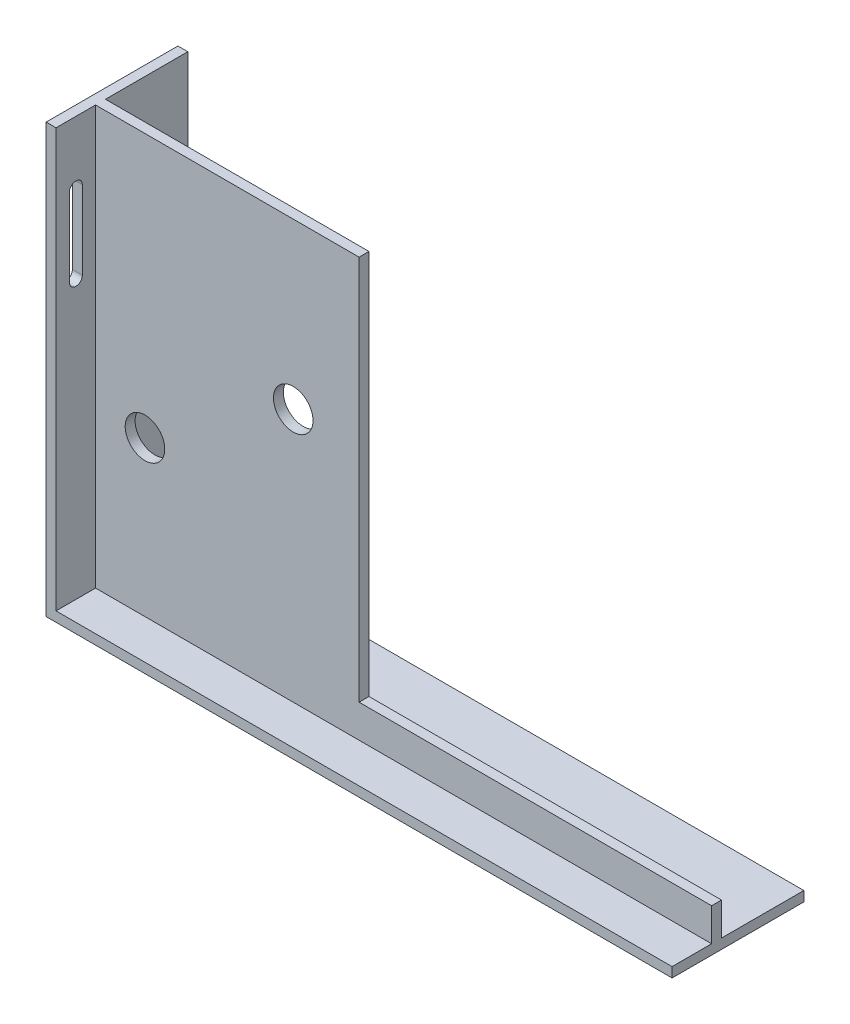
ISO-10303-21;
HEADER;
FILE_DESCRIPTION(('STEP AP214'),'2;1');
FILE_NAME('part.step','',(''),(''),'','','');
FILE_SCHEMA(('AUTOMOTIVE_DESIGN { 1 0 10303 214 1 1 1 1 }'));
ENDSEC;
DATA;
#1=APPLICATION_CONTEXT('core data for automotive mechanical design processes');
#2=APPLICATION_PROTOCOL_DEFINITION('international standard','automotive_design',2000,#1);
#3=PRODUCT_CONTEXT('',#1,'mechanical');
#4=PRODUCT('Part','Part','',(#3));
#5=PRODUCT_RELATED_PRODUCT_CATEGORY('part','',(#4));
#6=PRODUCT_DEFINITION_FORMATION('','',#4);
#7=PRODUCT_DEFINITION_CONTEXT('part definition',#1,'design');
#8=PRODUCT_DEFINITION('design','',#6,#7);
#9=PRODUCT_DEFINITION_SHAPE('','',#8);
#10=(LENGTH_UNIT() NAMED_UNIT(*) SI_UNIT(.MILLI.,.METRE.));
#11=(NAMED_UNIT(*) PLANE_ANGLE_UNIT() SI_UNIT($,.RADIAN.));
#12=(NAMED_UNIT(*) SI_UNIT($,.STERADIAN.) SOLID_ANGLE_UNIT());
#13=UNCERTAINTY_MEASURE_WITH_UNIT(LENGTH_MEASURE(1.E-05),#10,'distance_accuracy_value','');
#14=(GEOMETRIC_REPRESENTATION_CONTEXT(3) GLOBAL_UNCERTAINTY_ASSIGNED_CONTEXT((#13)) GLOBAL_UNIT_ASSIGNED_CONTEXT((#10,
#11,#12)) REPRESENTATION_CONTEXT('',''));
#15=CARTESIAN_POINT('',(0.,0.,0.));
#16=DIRECTION('',(0.,0.,1.));
#17=DIRECTION('',(1.,0.,0.));
#18=AXIS2_PLACEMENT_3D('',#15,#16,#17);
#19=CARTESIAN_POINT('',(-3.,3.,-25.));
#20=DIRECTION('',(0.,-1.,0.));
#21=DIRECTION('',(0.,0.,-1.));
#22=AXIS2_PLACEMENT_3D('',#19,#20,#21);
#23=PLANE('',#22);
#24=DIRECTION('',(0.,0.,1.));
#25=VECTOR('',#24,1.);
#26=CARTESIAN_POINT('',(187.,3.,15.));
#27=LINE('',#26,#25);
#28=CARTESIAN_POINT('',(187.,3.,3.));
#29=VERTEX_POINT('',#28);
#30=CARTESIAN_POINT('',(187.,3.,15.));
#31=VERTEX_POINT('',#30);
#32=EDGE_CURVE('E198',#29,#31,#27,.T.);
#33=ORIENTED_EDGE('',*,*,#32,.F.);
#34=DIRECTION('',(-1.,0.,0.));
#35=VECTOR('',#34,1.);
#36=CARTESIAN_POINT('',(0.,3.,3.));
#37=LINE('',#36,#35);
#38=CARTESIAN_POINT('',(0.,3.,3.));
#39=VERTEX_POINT('',#38);
#40=EDGE_CURVE('E211',#29,#39,#37,.T.);
#41=ORIENTED_EDGE('',*,*,#40,.T.);
#42=DIRECTION('',(0.,0.,1.));
#43=VECTOR('',#42,1.);
#44=CARTESIAN_POINT('',(0.,3.,-25.));
#45=LINE('',#44,#43);
#46=CARTESIAN_POINT('',(0.,3.,15.));
#47=VERTEX_POINT('',#46);
#48=EDGE_CURVE('E11',#39,#47,#45,.T.);
#49=ORIENTED_EDGE('',*,*,#48,.T.);
#50=DIRECTION('',(-1.,0.,0.));
#51=VECTOR('',#50,1.);
#52=CARTESIAN_POINT('',(-3.,3.,15.));
#53=LINE('',#52,#51);
#54=EDGE_CURVE('E202',#31,#47,#53,.T.);
#55=ORIENTED_EDGE('',*,*,#54,.F.);
#56=EDGE_LOOP('',(#33,#41,#49,#55));
#57=FACE_BOUND('',#56,.T.);
#58=ADVANCED_FACE('F32',(#57),#23,.F.);
#59=CARTESIAN_POINT('',(80.,0.,3.));
#60=DIRECTION('',(-1.,0.,0.));
#61=DIRECTION('',(0.,0.,1.));
#62=AXIS2_PLACEMENT_3D('',#59,#60,#61);
#63=PLANE('',#62);
#64=DIRECTION('',(0.,1.,0.));
#65=VECTOR('',#64,1.);
#66=CARTESIAN_POINT('',(80.,0.,3.));
#67=LINE('',#66,#65);
#68=CARTESIAN_POINT('',(80.,13.,3.));
#69=VERTEX_POINT('',#68);
#70=CARTESIAN_POINT('',(80.,130.,3.));
#71=VERTEX_POINT('',#70);
#72=EDGE_CURVE('E356',#69,#71,#67,.T.);
#73=ORIENTED_EDGE('',*,*,#72,.F.);
#74=DIRECTION('',(0.,0.,-1.));
#75=VECTOR('',#74,1.);
#76=CARTESIAN_POINT('',(80.,13.,110.466273779265));
#77=LINE('',#76,#75);
#78=CARTESIAN_POINT('',(80.,13.,0.));
#79=VERTEX_POINT('',#78);
#80=EDGE_CURVE('E190',#69,#79,#77,.T.);
#81=ORIENTED_EDGE('',*,*,#80,.T.);
#82=DIRECTION('',(0.,1.,0.));
#83=VECTOR('',#82,1.);
#84=CARTESIAN_POINT('',(80.,0.,0.));
#85=LINE('',#84,#83);
#86=CARTESIAN_POINT('',(80.,130.,0.));
#87=VERTEX_POINT('',#86);
#88=EDGE_CURVE('E370',#79,#87,#85,.T.);
#89=ORIENTED_EDGE('',*,*,#88,.T.);
#90=DIRECTION('',(0.,0.,-1.));
#91=VECTOR('',#90,1.);
#92=CARTESIAN_POINT('',(80.,130.,3.));
#93=LINE('',#92,#91);
#94=EDGE_CURVE('E40',#71,#87,#93,.T.);
#95=ORIENTED_EDGE('',*,*,#94,.F.);
#96=EDGE_LOOP('',(#73,#81,#89,#95));
#97=FACE_BOUND('',#96,.T.);
#98=ADVANCED_FACE('F302',(#97),#63,.F.);
#99=CARTESIAN_POINT('',(0.,130.,3.));
#100=DIRECTION('',(0.,0.,-1.));
#101=DIRECTION('',(-1.,0.,0.));
#102=AXIS2_PLACEMENT_3D('',#99,#100,#101);
#103=PLANE('',#102);
#104=CARTESIAN_POINT('',(60.,80.,3.));
#105=DIRECTION('',(0.,0.,1.));
#106=DIRECTION('',(1.,0.,0.));
#107=AXIS2_PLACEMENT_3D('',#104,#105,#106);
#108=CIRCLE('',#107,6.);
#109=CARTESIAN_POINT('',(66.,80.,3.));
#110=VERTEX_POINT('',#109);
#111=EDGE_CURVE('E347',#110,#110,#108,.T.);
#112=ORIENTED_EDGE('',*,*,#111,.F.);
#113=EDGE_LOOP('',(#112));
#114=FACE_BOUND('',#113,.T.);
#115=CARTESIAN_POINT('',(15.,50.,3.));
#116=DIRECTION('',(0.,0.,1.));
#117=DIRECTION('',(1.,0.,0.));
#118=AXIS2_PLACEMENT_3D('',#115,#116,#117);
#119=CIRCLE('',#118,6.);
#120=CARTESIAN_POINT('',(21.,50.,3.));
#121=VERTEX_POINT('',#120);
#122=EDGE_CURVE('E247',#121,#121,#119,.T.);
#123=ORIENTED_EDGE('',*,*,#122,.F.);
#124=EDGE_LOOP('',(#123));
#125=FACE_BOUND('',#124,.T.);
#126=ORIENTED_EDGE('',*,*,#40,.F.);
#127=DIRECTION('',(0.,1.,0.));
#128=VECTOR('',#127,1.);
#129=CARTESIAN_POINT('',(187.,3.,3.));
#130=LINE('',#129,#128);
#131=CARTESIAN_POINT('',(187.,13.,3.));
#132=VERTEX_POINT('',#131);
#133=EDGE_CURVE('E181',#29,#132,#130,.T.);
#134=ORIENTED_EDGE('',*,*,#133,.T.);
#135=DIRECTION('',(-1.,0.,0.));
#136=VECTOR('',#135,1.);
#137=CARTESIAN_POINT('',(80.,13.,3.));
#138=LINE('',#137,#136);
#139=EDGE_CURVE('E183',#132,#69,#138,.T.);
#140=ORIENTED_EDGE('',*,*,#139,.T.);
#141=ORIENTED_EDGE('',*,*,#72,.T.);
#142=DIRECTION('',(-1.,0.,0.));
#143=VECTOR('',#142,1.);
#144=CARTESIAN_POINT('',(0.,130.,3.));
#145=LINE('',#144,#143);
#146=CARTESIAN_POINT('',(0.,130.,3.));
#147=VERTEX_POINT('',#146);
#148=EDGE_CURVE('E364',#71,#147,#145,.T.);
#149=ORIENTED_EDGE('',*,*,#148,.T.);
#150=DIRECTION('',(0.,-1.,0.));
#151=VECTOR('',#150,1.);
#152=CARTESIAN_POINT('',(0.,0.,3.));
#153=LINE('',#152,#151);
#154=EDGE_CURVE('E359',#147,#39,#153,.T.);
#155=ORIENTED_EDGE('',*,*,#154,.T.);
#156=EDGE_LOOP('',(#126,#134,#140,#141,#149,#155));
#157=FACE_BOUND('',#156,.T.);
#158=ADVANCED_FACE('F308',(#114,#125,#157),#103,.F.);
#159=CARTESIAN_POINT('',(0.,130.,0.));
#160=DIRECTION('',(0.,0.,-1.));
#161=DIRECTION('',(-1.,0.,0.));
#162=AXIS2_PLACEMENT_3D('',#159,#160,#161);
#163=PLANE('',#162);
#164=CARTESIAN_POINT('',(60.,80.,0.));
#165=DIRECTION('',(0.,0.,1.));
#166=DIRECTION('',(1.,0.,0.));
#167=AXIS2_PLACEMENT_3D('',#164,#165,#166);
#168=CIRCLE('',#167,6.);
#169=CARTESIAN_POINT('',(66.,80.,0.));
#170=VERTEX_POINT('',#169);
#171=EDGE_CURVE('E343',#170,#170,#168,.T.);
#172=ORIENTED_EDGE('',*,*,#171,.T.);
#173=EDGE_LOOP('',(#172));
#174=FACE_BOUND('',#173,.T.);
#175=CARTESIAN_POINT('',(15.,50.,0.));
#176=DIRECTION('',(0.,0.,1.));
#177=DIRECTION('',(1.,0.,0.));
#178=AXIS2_PLACEMENT_3D('',#175,#176,#177);
#179=CIRCLE('',#178,6.);
#180=CARTESIAN_POINT('',(21.,50.,0.));
#181=VERTEX_POINT('',#180);
#182=EDGE_CURVE('E346',#181,#181,#179,.T.);
#183=ORIENTED_EDGE('',*,*,#182,.T.);
#184=EDGE_LOOP('',(#183));
#185=FACE_BOUND('',#184,.T.);
#186=ORIENTED_EDGE('',*,*,#88,.F.);
#187=DIRECTION('',(1.,0.,0.));
#188=VECTOR('',#187,1.);
#189=CARTESIAN_POINT('',(80.,13.,0.));
#190=LINE('',#189,#188);
#191=CARTESIAN_POINT('',(187.,13.,0.));
#192=VERTEX_POINT('',#191);
#193=EDGE_CURVE('E177',#79,#192,#190,.T.);
#194=ORIENTED_EDGE('',*,*,#193,.T.);
#195=DIRECTION('',(0.,-1.,0.));
#196=VECTOR('',#195,1.);
#197=CARTESIAN_POINT('',(187.,3.,0.));
#198=LINE('',#197,#196);
#199=CARTESIAN_POINT('',(187.,3.,0.));
#200=VERTEX_POINT('',#199);
#201=EDGE_CURVE('E187',#192,#200,#198,.T.);
#202=ORIENTED_EDGE('',*,*,#201,.T.);
#203=DIRECTION('',(-1.,0.,0.));
#204=VECTOR('',#203,1.);
#205=CARTESIAN_POINT('',(0.,3.,0.));
#206=LINE('',#205,#204);
#207=CARTESIAN_POINT('',(0.,3.,0.));
#208=VERTEX_POINT('',#207);
#209=EDGE_CURVE('E215',#200,#208,#206,.T.);
#210=ORIENTED_EDGE('',*,*,#209,.T.);
#211=DIRECTION('',(0.,-1.,0.));
#212=VECTOR('',#211,1.);
#213=CARTESIAN_POINT('',(0.,0.,0.));
#214=LINE('',#213,#212);
#215=CARTESIAN_POINT('',(0.,130.,0.));
#216=VERTEX_POINT('',#215);
#217=EDGE_CURVE('E268',#216,#208,#214,.T.);
#218=ORIENTED_EDGE('',*,*,#217,.F.);
#219=DIRECTION('',(-1.,0.,0.));
#220=VECTOR('',#219,1.);
#221=CARTESIAN_POINT('',(0.,130.,0.));
#222=LINE('',#221,#220);
#223=EDGE_CURVE('E288',#87,#216,#222,.T.);
#224=ORIENTED_EDGE('',*,*,#223,.F.);
#225=EDGE_LOOP('',(#186,#194,#202,#210,#218,#224));
#226=FACE_BOUND('',#225,.T.);
#227=ADVANCED_FACE('F274',(#174,#185,#226),#163,.T.);
#228=CARTESIAN_POINT('',(0.,0.,-25.));
#229=DIRECTION('',(-1.,0.,0.));
#230=DIRECTION('',(0.,0.,1.));
#231=AXIS2_PLACEMENT_3D('',#228,#229,#230);
#232=PLANE('',#231);
#233=DIRECTION('',(0.,0.,1.));
#234=VECTOR('',#233,1.);
#235=CARTESIAN_POINT('',(0.,3.,-25.));
#236=LINE('',#235,#234);
#237=CARTESIAN_POINT('',(0.,3.,-25.));
#238=VERTEX_POINT('',#237);
#239=EDGE_CURVE('E218',#238,#208,#236,.T.);
#240=ORIENTED_EDGE('',*,*,#239,.F.);
#241=DIRECTION('',(0.,-1.,0.));
#242=VECTOR('',#241,1.);
#243=CARTESIAN_POINT('',(0.,130.,-25.));
#244=LINE('',#243,#242);
#245=CARTESIAN_POINT('',(0.,130.,-25.));
#246=VERTEX_POINT('',#245);
#247=EDGE_CURVE('E220',#246,#238,#244,.T.);
#248=ORIENTED_EDGE('',*,*,#247,.F.);
#249=DIRECTION('',(0.,0.,-1.));
#250=VECTOR('',#249,1.);
#251=CARTESIAN_POINT('',(0.,130.,-25.));
#252=LINE('',#251,#250);
#253=EDGE_CURVE('E235',#216,#246,#252,.T.);
#254=ORIENTED_EDGE('',*,*,#253,.F.);
#255=ORIENTED_EDGE('',*,*,#217,.T.);
#256=EDGE_LOOP('',(#240,#248,#254,#255));
#257=FACE_BOUND('',#256,.T.);
#258=ADVANCED_FACE('F264',(#257),#232,.F.);
#259=DIRECTION('',(0.,-1.,0.));
#260=VECTOR('',#259,1.);
#261=CARTESIAN_POINT('',(0.,111.057268812264,10.928412033465));
#262=LINE('',#261,#260);
#263=CARTESIAN_POINT('',(0.,111.057268812264,10.928412033465));
#264=VERTEX_POINT('',#263);
#265=CARTESIAN_POINT('',(0.,87.2647744264259,10.928412033465));
#266=VERTEX_POINT('',#265);
#267=EDGE_CURVE('E171',#264,#266,#262,.T.);
#268=ORIENTED_EDGE('',*,*,#267,.F.);
#269=CARTESIAN_POINT('',(0.,111.057268812264,8.97571447607959));
#270=DIRECTION('',(1.,0.,0.));
#271=DIRECTION('',(0.,0.,-1.));
#272=AXIS2_PLACEMENT_3D('',#269,#270,#271);
#273=CIRCLE('',#272,1.95269755738536);
#274=CARTESIAN_POINT('',(0.,111.057268812264,7.02301691869422));
#275=VERTEX_POINT('',#274);
#276=EDGE_CURVE('E47',#275,#264,#273,.T.);
#277=ORIENTED_EDGE('',*,*,#276,.F.);
#278=DIRECTION('',(0.,1.,0.));
#279=VECTOR('',#278,1.);
#280=CARTESIAN_POINT('',(0.,111.057268812264,7.02301691869422));
#281=LINE('',#280,#279);
#282=CARTESIAN_POINT('',(0.,87.2647744264259,7.02301691869422));
#283=VERTEX_POINT('',#282);
#284=EDGE_CURVE('E162',#283,#275,#281,.T.);
#285=ORIENTED_EDGE('',*,*,#284,.F.);
#286=CARTESIAN_POINT('',(0.,87.2647744264259,8.97571447607959));
#287=DIRECTION('',(1.,0.,0.));
#288=DIRECTION('',(0.,0.,-1.));
#289=AXIS2_PLACEMENT_3D('',#286,#287,#288);
#290=CIRCLE('',#289,1.95269755738536);
#291=EDGE_CURVE('E165',#266,#283,#290,.T.);
#292=ORIENTED_EDGE('',*,*,#291,.F.);
#293=EDGE_LOOP('',(#268,#277,#285,#292));
#294=FACE_BOUND('',#293,.T.);
#295=ORIENTED_EDGE('',*,*,#48,.F.);
#296=ORIENTED_EDGE('',*,*,#154,.F.);
#297=CARTESIAN_POINT('',(0.,130.,15.));
#298=VERTEX_POINT('',#297);
#299=EDGE_CURVE('E224',#298,#147,#252,.T.);
#300=ORIENTED_EDGE('',*,*,#299,.F.);
#301=DIRECTION('',(0.,1.,0.));
#302=VECTOR('',#301,1.);
#303=CARTESIAN_POINT('',(0.,130.,15.));
#304=LINE('',#303,#302);
#305=EDGE_CURVE('E233',#47,#298,#304,.T.);
#306=ORIENTED_EDGE('',*,*,#305,.F.);
#307=EDGE_LOOP('',(#295,#296,#300,#306));
#308=FACE_BOUND('',#307,.T.);
#309=ADVANCED_FACE('F299',(#294,#308),#232,.F.);
#310=CARTESIAN_POINT('',(0.,0.,3.));
#311=DIRECTION('',(0.,1.,0.));
#312=DIRECTION('',(0.,0.,1.));
#313=AXIS2_PLACEMENT_3D('',#310,#311,#312);
#314=PLANE('',#313);
#315=DIRECTION('',(1.,0.,0.));
#316=VECTOR('',#315,1.);
#317=CARTESIAN_POINT('',(-3.,0.,-25.));
#318=LINE('',#317,#316);
#319=CARTESIAN_POINT('',(-3.,0.,-25.));
#320=VERTEX_POINT('',#319);
#321=CARTESIAN_POINT('',(187.,0.,-25.));
#322=VERTEX_POINT('',#321);
#323=EDGE_CURVE('E245',#320,#322,#318,.T.);
#324=ORIENTED_EDGE('',*,*,#323,.T.);
#325=DIRECTION('',(0.,0.,1.));
#326=VECTOR('',#325,1.);
#327=CARTESIAN_POINT('',(187.,0.,15.));
#328=LINE('',#327,#326);
#329=CARTESIAN_POINT('',(187.,0.,15.));
#330=VERTEX_POINT('',#329);
#331=EDGE_CURVE('E195',#322,#330,#328,.T.);
#332=ORIENTED_EDGE('',*,*,#331,.T.);
#333=DIRECTION('',(1.,0.,0.));
#334=VECTOR('',#333,1.);
#335=CARTESIAN_POINT('',(-3.,0.,15.));
#336=LINE('',#335,#334);
#337=CARTESIAN_POINT('',(-3.,0.,15.));
#338=VERTEX_POINT('',#337);
#339=EDGE_CURVE('E248',#338,#330,#336,.T.);
#340=ORIENTED_EDGE('',*,*,#339,.F.);
#341=DIRECTION('',(0.,0.,1.));
#342=VECTOR('',#341,1.);
#343=CARTESIAN_POINT('',(-3.,0.,-25.));
#344=LINE('',#343,#342);
#345=EDGE_CURVE('E223',#320,#338,#344,.T.);
#346=ORIENTED_EDGE('',*,*,#345,.F.);
#347=EDGE_LOOP('',(#324,#332,#340,#346));
#348=FACE_BOUND('',#347,.T.);
#349=ADVANCED_FACE('F34',(#348),#314,.F.);
#350=CARTESIAN_POINT('',(0.,130.,3.));
#351=DIRECTION('',(0.,-1.,0.));
#352=DIRECTION('',(0.,0.,-1.));
#353=AXIS2_PLACEMENT_3D('',#350,#351,#352);
#354=PLANE('',#353);
#355=ORIENTED_EDGE('',*,*,#223,.T.);
#356=ORIENTED_EDGE('',*,*,#253,.T.);
#357=DIRECTION('',(1.,0.,0.));
#358=VECTOR('',#357,1.);
#359=CARTESIAN_POINT('',(-3.,130.,-25.));
#360=LINE('',#359,#358);
#361=CARTESIAN_POINT('',(-3.,130.,-25.));
#362=VERTEX_POINT('',#361);
#363=EDGE_CURVE('E230',#362,#246,#360,.T.);
#364=ORIENTED_EDGE('',*,*,#363,.F.);
#365=DIRECTION('',(0.,0.,-1.));
#366=VECTOR('',#365,1.);
#367=CARTESIAN_POINT('',(-3.,130.,-25.));
#368=LINE('',#367,#366);
#369=CARTESIAN_POINT('',(-3.,130.,15.));
#370=VERTEX_POINT('',#369);
#371=EDGE_CURVE('E228',#370,#362,#368,.T.);
#372=ORIENTED_EDGE('',*,*,#371,.F.);
#373=DIRECTION('',(1.,0.,0.));
#374=VECTOR('',#373,1.);
#375=CARTESIAN_POINT('',(-3.,130.,15.));
#376=LINE('',#375,#374);
#377=EDGE_CURVE('E249',#370,#298,#376,.T.);
#378=ORIENTED_EDGE('',*,*,#377,.T.);
#379=ORIENTED_EDGE('',*,*,#299,.T.);
#380=ORIENTED_EDGE('',*,*,#148,.F.);
#381=ORIENTED_EDGE('',*,*,#94,.T.);
#382=EDGE_LOOP('',(#355,#356,#364,#372,#378,#379,#380,#381));
#383=FACE_BOUND('',#382,.T.);
#384=ADVANCED_FACE('F286',(#383),#354,.F.);
#385=CARTESIAN_POINT('',(60.,80.,0.));
#386=DIRECTION('',(0.,0.,1.));
#387=DIRECTION('',(1.,0.,0.));
#388=AXIS2_PLACEMENT_3D('',#385,#386,#387);
#389=CYLINDRICAL_SURFACE('',#388,6.);
#390=ORIENTED_EDGE('',*,*,#171,.F.);
#391=EDGE_LOOP('',(#390));
#392=FACE_BOUND('',#391,.T.);
#393=ORIENTED_EDGE('',*,*,#111,.T.);
#394=EDGE_LOOP('',(#393));
#395=FACE_BOUND('',#394,.T.);
#396=ADVANCED_FACE('F290',(#392,#395),#389,.F.);
#397=CARTESIAN_POINT('',(15.,50.,0.));
#398=DIRECTION('',(0.,0.,1.));
#399=DIRECTION('',(1.,0.,0.));
#400=AXIS2_PLACEMENT_3D('',#397,#398,#399);
#401=CYLINDRICAL_SURFACE('',#400,6.);
#402=ORIENTED_EDGE('',*,*,#182,.F.);
#403=EDGE_LOOP('',(#402));
#404=FACE_BOUND('',#403,.T.);
#405=ORIENTED_EDGE('',*,*,#122,.T.);
#406=EDGE_LOOP('',(#405));
#407=FACE_BOUND('',#406,.T.);
#408=ADVANCED_FACE('F296',(#404,#407),#401,.F.);
#409=CARTESIAN_POINT('',(-3.,130.,-25.));
#410=DIRECTION('',(0.,0.,1.));
#411=DIRECTION('',(0.,-1.,0.));
#412=AXIS2_PLACEMENT_3D('',#409,#410,#411);
#413=PLANE('',#412);
#414=ORIENTED_EDGE('',*,*,#323,.F.);
#415=DIRECTION('',(0.,-1.,0.));
#416=VECTOR('',#415,1.);
#417=CARTESIAN_POINT('',(-3.,130.,-25.));
#418=LINE('',#417,#416);
#419=EDGE_CURVE('E221',#362,#320,#418,.T.);
#420=ORIENTED_EDGE('',*,*,#419,.F.);
#421=ORIENTED_EDGE('',*,*,#363,.T.);
#422=ORIENTED_EDGE('',*,*,#247,.T.);
#423=DIRECTION('',(1.,0.,0.));
#424=VECTOR('',#423,1.);
#425=CARTESIAN_POINT('',(-3.,3.,-25.));
#426=LINE('',#425,#424);
#427=CARTESIAN_POINT('',(187.,3.,-25.));
#428=VERTEX_POINT('',#427);
#429=EDGE_CURVE('E196',#238,#428,#426,.T.);
#430=ORIENTED_EDGE('',*,*,#429,.T.);
#431=DIRECTION('',(0.,-1.,0.));
#432=VECTOR('',#431,1.);
#433=CARTESIAN_POINT('',(187.,3.,-25.));
#434=LINE('',#433,#432);
#435=EDGE_CURVE('E205',#428,#322,#434,.T.);
#436=ORIENTED_EDGE('',*,*,#435,.T.);
#437=EDGE_LOOP('',(#414,#420,#421,#422,#430,#436));
#438=FACE_BOUND('',#437,.T.);
#439=ADVANCED_FACE('F261',(#438),#413,.F.);
#440=CARTESIAN_POINT('',(-3.,130.,15.));
#441=DIRECTION('',(0.,0.,-1.));
#442=DIRECTION('',(0.,1.,0.));
#443=AXIS2_PLACEMENT_3D('',#440,#441,#442);
#444=PLANE('',#443);
#445=ORIENTED_EDGE('',*,*,#339,.T.);
#446=DIRECTION('',(0.,-1.,0.));
#447=VECTOR('',#446,1.);
#448=CARTESIAN_POINT('',(187.,3.,15.));
#449=LINE('',#448,#447);
#450=EDGE_CURVE('E208',#31,#330,#449,.T.);
#451=ORIENTED_EDGE('',*,*,#450,.F.);
#452=ORIENTED_EDGE('',*,*,#54,.T.);
#453=ORIENTED_EDGE('',*,*,#305,.T.);
#454=ORIENTED_EDGE('',*,*,#377,.F.);
#455=DIRECTION('',(0.,1.,0.));
#456=VECTOR('',#455,1.);
#457=CARTESIAN_POINT('',(-3.,130.,15.));
#458=LINE('',#457,#456);
#459=EDGE_CURVE('E226',#338,#370,#458,.T.);
#460=ORIENTED_EDGE('',*,*,#459,.F.);
#461=EDGE_LOOP('',(#445,#451,#452,#453,#454,#460));
#462=FACE_BOUND('',#461,.T.);
#463=ADVANCED_FACE('F319',(#462),#444,.F.);
#464=CARTESIAN_POINT('',(-3.,0.,-25.));
#465=DIRECTION('',(-1.,0.,0.));
#466=DIRECTION('',(0.,0.,1.));
#467=AXIS2_PLACEMENT_3D('',#464,#465,#466);
#468=PLANE('',#467);
#469=CARTESIAN_POINT('',(-3.,111.057268812264,8.97571447607959));
#470=DIRECTION('',(1.,0.,0.));
#471=DIRECTION('',(0.,0.,-1.));
#472=AXIS2_PLACEMENT_3D('',#469,#470,#471);
#473=CIRCLE('',#472,1.95269755738536);
#474=CARTESIAN_POINT('',(-3.,111.057268812264,7.02301691869422));
#475=VERTEX_POINT('',#474);
#476=CARTESIAN_POINT('',(-3.,111.057268812264,10.928412033465));
#477=VERTEX_POINT('',#476);
#478=EDGE_CURVE('E146',#475,#477,#473,.T.);
#479=ORIENTED_EDGE('',*,*,#478,.T.);
#480=DIRECTION('',(0.,-1.,0.));
#481=VECTOR('',#480,1.);
#482=CARTESIAN_POINT('',(-3.,111.057268812264,10.928412033465));
#483=LINE('',#482,#481);
#484=CARTESIAN_POINT('',(-3.,87.2647744264259,10.928412033465));
#485=VERTEX_POINT('',#484);
#486=EDGE_CURVE('E155',#477,#485,#483,.T.);
#487=ORIENTED_EDGE('',*,*,#486,.T.);
#488=CARTESIAN_POINT('',(-3.,87.2647744264259,8.97571447607959));
#489=DIRECTION('',(1.,0.,0.));
#490=DIRECTION('',(0.,0.,-1.));
#491=AXIS2_PLACEMENT_3D('',#488,#489,#490);
#492=CIRCLE('',#491,1.95269755738536);
#493=CARTESIAN_POINT('',(-3.,87.2647744264259,7.02301691869422));
#494=VERTEX_POINT('',#493);
#495=EDGE_CURVE('E55',#485,#494,#492,.T.);
#496=ORIENTED_EDGE('',*,*,#495,.T.);
#497=DIRECTION('',(0.,1.,0.));
#498=VECTOR('',#497,1.);
#499=CARTESIAN_POINT('',(-3.,111.057268812264,7.02301691869422));
#500=LINE('',#499,#498);
#501=EDGE_CURVE('E152',#494,#475,#500,.T.);
#502=ORIENTED_EDGE('',*,*,#501,.T.);
#503=EDGE_LOOP('',(#479,#487,#496,#502));
#504=FACE_BOUND('',#503,.T.);
#505=ORIENTED_EDGE('',*,*,#459,.T.);
#506=ORIENTED_EDGE('',*,*,#371,.T.);
#507=ORIENTED_EDGE('',*,*,#419,.T.);
#508=ORIENTED_EDGE('',*,*,#345,.T.);
#509=EDGE_LOOP('',(#505,#506,#507,#508));
#510=FACE_BOUND('',#509,.T.);
#511=ADVANCED_FACE('F159',(#504,#510),#468,.T.);
#512=ORIENTED_EDGE('',*,*,#209,.F.);
#513=EDGE_CURVE('E199',#428,#200,#27,.T.);
#514=ORIENTED_EDGE('',*,*,#513,.F.);
#515=ORIENTED_EDGE('',*,*,#429,.F.);
#516=ORIENTED_EDGE('',*,*,#239,.T.);
#517=EDGE_LOOP('',(#512,#514,#515,#516));
#518=FACE_BOUND('',#517,.T.);
#519=ADVANCED_FACE('F270',(#518),#23,.F.);
#520=CARTESIAN_POINT('',(187.,3.,15.));
#521=DIRECTION('',(1.,0.,0.));
#522=DIRECTION('',(0.,0.,-1.));
#523=AXIS2_PLACEMENT_3D('',#520,#521,#522);
#524=PLANE('',#523);
#525=ORIENTED_EDGE('',*,*,#331,.F.);
#526=ORIENTED_EDGE('',*,*,#435,.F.);
#527=ORIENTED_EDGE('',*,*,#513,.T.);
#528=ORIENTED_EDGE('',*,*,#201,.F.);
#529=DIRECTION('',(0.,0.,-1.));
#530=VECTOR('',#529,1.);
#531=CARTESIAN_POINT('',(187.,13.,110.466273779265));
#532=LINE('',#531,#530);
#533=EDGE_CURVE('E184',#132,#192,#532,.T.);
#534=ORIENTED_EDGE('',*,*,#533,.F.);
#535=ORIENTED_EDGE('',*,*,#133,.F.);
#536=ORIENTED_EDGE('',*,*,#32,.T.);
#537=ORIENTED_EDGE('',*,*,#450,.T.);
#538=EDGE_LOOP('',(#525,#526,#527,#528,#534,#535,#536,#537));
#539=FACE_BOUND('',#538,.T.);
#540=ADVANCED_FACE('F281',(#539),#524,.T.);
#541=CARTESIAN_POINT('',(80.,13.,110.466273779265));
#542=DIRECTION('',(0.,1.,0.));
#543=DIRECTION('',(-1.,0.,0.));
#544=AXIS2_PLACEMENT_3D('',#541,#542,#543);
#545=PLANE('',#544);
#546=ORIENTED_EDGE('',*,*,#139,.F.);
#547=ORIENTED_EDGE('',*,*,#533,.T.);
#548=ORIENTED_EDGE('',*,*,#193,.F.);
#549=ORIENTED_EDGE('',*,*,#80,.F.);
#550=EDGE_LOOP('',(#546,#547,#548,#549));
#551=FACE_BOUND('',#550,.T.);
#552=ADVANCED_FACE('F318',(#551),#545,.T.);
#553=CARTESIAN_POINT('',(-3.,111.057268812264,8.97571447607959));
#554=DIRECTION('',(1.,0.,0.));
#555=DIRECTION('',(0.,0.,-1.));
#556=AXIS2_PLACEMENT_3D('',#553,#554,#555);
#557=CYLINDRICAL_SURFACE('',#556,1.95269755738536);
#558=ORIENTED_EDGE('',*,*,#276,.T.);
#559=DIRECTION('',(1.,0.,0.));
#560=VECTOR('',#559,1.);
#561=CARTESIAN_POINT('',(-3.,111.057268812264,10.928412033465));
#562=LINE('',#561,#560);
#563=EDGE_CURVE('E142',#477,#264,#562,.T.);
#564=ORIENTED_EDGE('',*,*,#563,.F.);
#565=ORIENTED_EDGE('',*,*,#478,.F.);
#566=DIRECTION('',(1.,0.,0.));
#567=VECTOR('',#566,1.);
#568=CARTESIAN_POINT('',(-3.,111.057268812264,7.02301691869422));
#569=LINE('',#568,#567);
#570=EDGE_CURVE('E175',#475,#275,#569,.T.);
#571=ORIENTED_EDGE('',*,*,#570,.T.);
#572=EDGE_LOOP('',(#558,#564,#565,#571));
#573=FACE_BOUND('',#572,.T.);
#574=ADVANCED_FACE('F144',(#573),#557,.F.);
#575=CARTESIAN_POINT('',(-3.,111.057268812264,7.02301691869422));
#576=DIRECTION('',(0.,0.,-1.));
#577=DIRECTION('',(-1.,0.,0.));
#578=AXIS2_PLACEMENT_3D('',#575,#576,#577);
#579=PLANE('',#578);
#580=ORIENTED_EDGE('',*,*,#284,.T.);
#581=ORIENTED_EDGE('',*,*,#570,.F.);
#582=ORIENTED_EDGE('',*,*,#501,.F.);
#583=DIRECTION('',(1.,0.,0.));
#584=VECTOR('',#583,1.);
#585=CARTESIAN_POINT('',(-3.,87.2647744264259,7.02301691869422));
#586=LINE('',#585,#584);
#587=EDGE_CURVE('E178',#494,#283,#586,.T.);
#588=ORIENTED_EDGE('',*,*,#587,.T.);
#589=EDGE_LOOP('',(#580,#581,#582,#588));
#590=FACE_BOUND('',#589,.T.);
#591=ADVANCED_FACE('F394',(#590),#579,.F.);
#592=CARTESIAN_POINT('',(-3.,87.2647744264259,8.97571447607959));
#593=DIRECTION('',(1.,0.,0.));
#594=DIRECTION('',(0.,0.,-1.));
#595=AXIS2_PLACEMENT_3D('',#592,#593,#594);
#596=CYLINDRICAL_SURFACE('',#595,1.95269755738536);
#597=ORIENTED_EDGE('',*,*,#291,.T.);
#598=ORIENTED_EDGE('',*,*,#587,.F.);
#599=ORIENTED_EDGE('',*,*,#495,.F.);
#600=DIRECTION('',(1.,0.,0.));
#601=VECTOR('',#600,1.);
#602=CARTESIAN_POINT('',(-3.,87.2647744264259,10.928412033465));
#603=LINE('',#602,#601);
#604=EDGE_CURVE('E151',#485,#266,#603,.T.);
#605=ORIENTED_EDGE('',*,*,#604,.T.);
#606=EDGE_LOOP('',(#597,#598,#599,#605));
#607=FACE_BOUND('',#606,.T.);
#608=ADVANCED_FACE('F392',(#607),#596,.F.);
#609=CARTESIAN_POINT('',(-3.,111.057268812264,10.928412033465));
#610=DIRECTION('',(0.,0.,1.));
#611=DIRECTION('',(1.,0.,0.));
#612=AXIS2_PLACEMENT_3D('',#609,#610,#611);
#613=PLANE('',#612);
#614=ORIENTED_EDGE('',*,*,#267,.T.);
#615=ORIENTED_EDGE('',*,*,#604,.F.);
#616=ORIENTED_EDGE('',*,*,#486,.F.);
#617=ORIENTED_EDGE('',*,*,#563,.T.);
#618=EDGE_LOOP('',(#614,#615,#616,#617));
#619=FACE_BOUND('',#618,.T.);
#620=ADVANCED_FACE('F156',(#619),#613,.F.);
#621=CLOSED_SHELL('',(#58,#98,#158,#227,#258,#309,#349,#384,#396,#408,#439,#463,#511,#519,#540,
#552,#574,#591,#608,#620));
#622=MANIFOLD_SOLID_BREP('B2',#621);
#623=ADVANCED_BREP_SHAPE_REPRESENTATION('',(#18,#622),#14);
#624=SHAPE_DEFINITION_REPRESENTATION(#9,#623);
ENDSEC;
END-ISO-10303-21;
